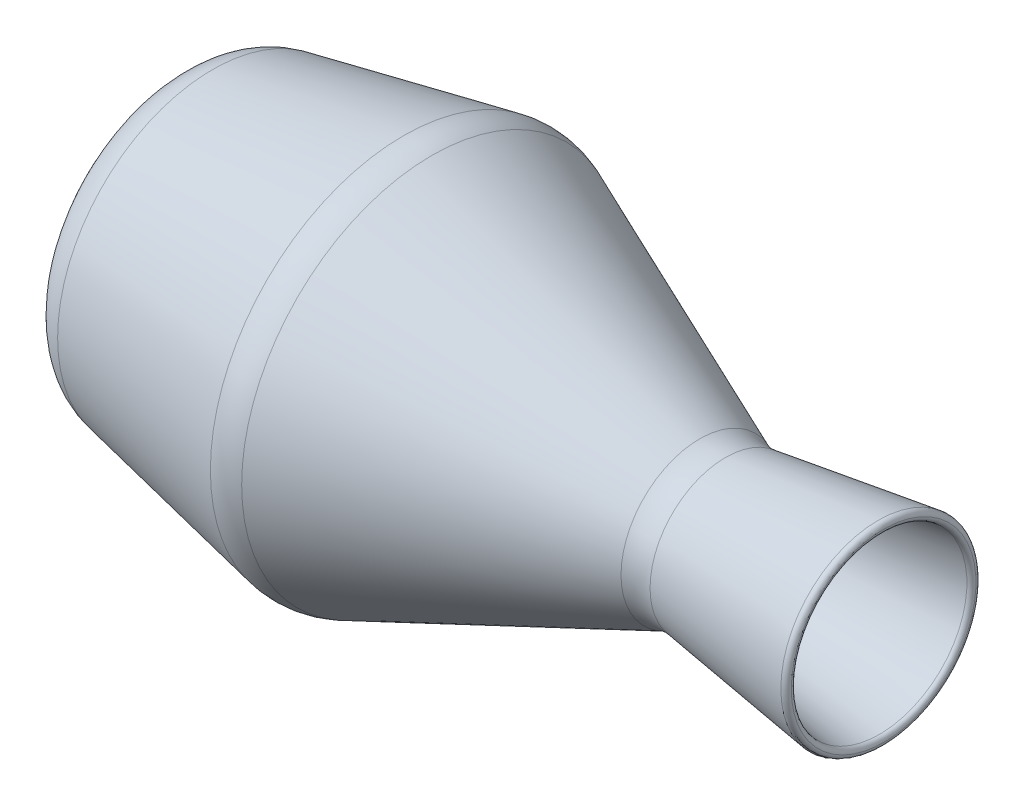
ISO-10303-21;
HEADER;
FILE_DESCRIPTION(('STEP AP214'),'2;1');
FILE_NAME('part.step','',(''),(''),'','','');
FILE_SCHEMA(('AUTOMOTIVE_DESIGN { 1 0 10303 214 1 1 1 1 }'));
ENDSEC;
DATA;
#1=APPLICATION_CONTEXT('core data for automotive mechanical design processes');
#2=APPLICATION_PROTOCOL_DEFINITION('international standard','automotive_design',2000,#1);
#3=PRODUCT_CONTEXT('',#1,'mechanical');
#4=PRODUCT('Part','Part','',(#3));
#5=PRODUCT_RELATED_PRODUCT_CATEGORY('part','',(#4));
#6=PRODUCT_DEFINITION_FORMATION('','',#4);
#7=PRODUCT_DEFINITION_CONTEXT('part definition',#1,'design');
#8=PRODUCT_DEFINITION('design','',#6,#7);
#9=PRODUCT_DEFINITION_SHAPE('','',#8);
#10=(LENGTH_UNIT() NAMED_UNIT(*) SI_UNIT(.MILLI.,.METRE.));
#11=(NAMED_UNIT(*) PLANE_ANGLE_UNIT() SI_UNIT($,.RADIAN.));
#12=(NAMED_UNIT(*) SI_UNIT($,.STERADIAN.) SOLID_ANGLE_UNIT());
#13=UNCERTAINTY_MEASURE_WITH_UNIT(LENGTH_MEASURE(1.E-05),#10,'distance_accuracy_value','');
#14=(GEOMETRIC_REPRESENTATION_CONTEXT(3) GLOBAL_UNCERTAINTY_ASSIGNED_CONTEXT((#13)) GLOBAL_UNIT_ASSIGNED_CONTEXT((#10,
#11,#12)) REPRESENTATION_CONTEXT('',''));
#15=CARTESIAN_POINT('',(0.,0.,0.));
#16=DIRECTION('',(0.,0.,1.));
#17=DIRECTION('',(1.,0.,0.));
#18=AXIS2_PLACEMENT_3D('',#15,#16,#17);
#19=CARTESIAN_POINT('',(30.9098844513369,0.,-4.58305425318152));
#20=DIRECTION('',(1.,0.,0.));
#21=DIRECTION('',(0.,0.,-1.));
#22=AXIS2_PLACEMENT_3D('',#19,#20,#21);
#23=CONICAL_SURFACE('',#22,12.9423259974754,0.141897054604164);
#24=CARTESIAN_POINT('',(33.6320099834152,0.,-4.58305425318152));
#25=DIRECTION('',(-1.,0.,0.));
#26=DIRECTION('',(0.,0.,1.));
#27=AXIS2_PLACEMENT_3D('',#24,#25,#26);
#28=CIRCLE('',#27,13.3312010734866);
#29=CARTESIAN_POINT('',(33.6320099834152,0.,8.7481468203051));
#30=VERTEX_POINT('',#29);
#31=EDGE_CURVE('E10',#30,#30,#28,.T.);
#32=ORIENTED_EDGE('',*,*,#31,.T.);
#33=EDGE_LOOP('',(#32));
#34=FACE_BOUND('',#33,.T.);
#35=CARTESIAN_POINT('',(65.3128882015152,0.,-4.58305425318152));
#36=DIRECTION('',(-1.,0.,0.));
#37=DIRECTION('',(0.,0.,1.));
#38=AXIS2_PLACEMENT_3D('',#35,#36,#37);
#39=CIRCLE('',#38,17.8570408189295);
#40=CARTESIAN_POINT('',(65.3128882015152,0.,13.273986565748));
#41=VERTEX_POINT('',#40);
#42=EDGE_CURVE('E79',#41,#41,#39,.F.);
#43=ORIENTED_EDGE('',*,*,#42,.T.);
#44=EDGE_LOOP('',(#43));
#45=FACE_BOUND('',#44,.T.);
#46=ADVANCED_FACE('F31',(#34,#45),#23,.F.);
#47=CARTESIAN_POINT('',(-29.0345745513105,0.,-4.58305425318152));
#48=DIRECTION('',(-1.,0.,0.));
#49=DIRECTION('',(0.,0.,1.));
#50=AXIS2_PLACEMENT_3D('',#47,#48,#49);
#51=CONICAL_SURFACE('',#50,37.9191839152452,0.394791119699762);
#52=CARTESIAN_POINT('',(-26.218627688099,0.,-4.58305425318152));
#53=DIRECTION('',(-1.,0.,0.));
#54=DIRECTION('',(0.,0.,1.));
#55=AXIS2_PLACEMENT_3D('',#52,#53,#54);
#56=CIRCLE('',#55,36.7458727222404);
#57=CARTESIAN_POINT('',(-26.218627688099,0.,32.1628184690589));
#58=VERTEX_POINT('',#57);
#59=EDGE_CURVE('E60',#58,#58,#56,.T.);
#60=ORIENTED_EDGE('',*,*,#59,.T.);
#61=EDGE_LOOP('',(#60));
#62=FACE_BOUND('',#61,.T.);
#63=CARTESIAN_POINT('',(28.3716425748883,0.,-4.58305425318152));
#64=DIRECTION('',(1.,0.,0.));
#65=DIRECTION('',(0.,0.,-1.));
#66=AXIS2_PLACEMENT_3D('',#63,#64,#65);
#67=CIRCLE('',#66,13.999926779329);
#68=CARTESIAN_POINT('',(28.3716425748883,0.,-18.5829810325106));
#69=VERTEX_POINT('',#68);
#70=EDGE_CURVE('E63',#69,#69,#67,.T.);
#71=ORIENTED_EDGE('',*,*,#70,.T.);
#72=EDGE_LOOP('',(#71));
#73=FACE_BOUND('',#72,.T.);
#74=ADVANCED_FACE('F106',(#62,#73),#51,.F.);
#75=CARTESIAN_POINT('',(-76.828533154722,0.,-4.58305425318152));
#76=DIRECTION('',(1.,0.,0.));
#77=DIRECTION('',(0.,0.,-1.));
#78=AXIS2_PLACEMENT_3D('',#75,#76,#77);
#79=CONICAL_SURFACE('',#78,28.3603921945629,0.197395559849881);
#80=CARTESIAN_POINT('',(-32.0259428856346,0.,-4.58305425318152));
#81=DIRECTION('',(1.,0.,0.));
#82=DIRECTION('',(0.,0.,-1.));
#83=AXIS2_PLACEMENT_3D('',#80,#81,#82);
#84=CIRCLE('',#83,37.3209102483804);
#85=CARTESIAN_POINT('',(-32.0259428856346,0.,-41.9039645015619));
#86=VERTEX_POINT('',#85);
#87=EDGE_CURVE('E54',#86,#86,#84,.T.);
#88=ORIENTED_EDGE('',*,*,#87,.T.);
#89=EDGE_LOOP('',(#88));
#90=FACE_BOUND('',#89,.T.);
#91=CARTESIAN_POINT('',(-68.7896945061039,0.,-4.58305425318152));
#92=DIRECTION('',(1.,0.,0.));
#93=DIRECTION('',(0.,0.,-1.));
#94=AXIS2_PLACEMENT_3D('',#91,#92,#93);
#95=CIRCLE('',#94,29.9681599242865);
#96=CARTESIAN_POINT('',(-68.7896945061039,0.,-34.551214177468));
#97=VERTEX_POINT('',#96);
#98=EDGE_CURVE('E57',#97,#97,#95,.F.);
#99=ORIENTED_EDGE('',*,*,#98,.T.);
#100=EDGE_LOOP('',(#99));
#101=FACE_BOUND('',#100,.T.);
#102=ADVANCED_FACE('F111',(#90,#101),#79,.F.);
#103=CARTESIAN_POINT('',(-76.828533154722,0.,-4.58305425318152));
#104=DIRECTION('',(-1.,0.,0.));
#105=DIRECTION('',(0.,0.,1.));
#106=AXIS2_PLACEMENT_3D('',#103,#104,#105);
#107=PLANE('',#106);
#108=CARTESIAN_POINT('',(-76.828533154722,0.,-4.58305425318152));
#109=DIRECTION('',(-1.,0.,0.));
#110=DIRECTION('',(0.,0.,1.));
#111=AXIS2_PLACEMENT_3D('',#108,#109,#110);
#112=CIRCLE('',#111,20.1623531673773);
#113=CARTESIAN_POINT('',(-76.828533154722,0.,15.5792989141958));
#114=VERTEX_POINT('',#113);
#115=EDGE_CURVE('E51',#114,#114,#112,.F.);
#116=ORIENTED_EDGE('',*,*,#115,.T.);
#117=EDGE_LOOP('',(#116));
#118=FACE_BOUND('',#117,.T.);
#119=ADVANCED_FACE('F117',(#118),#107,.F.);
#120=CARTESIAN_POINT('',(-78.8285331547221,0.,-4.58305425318152));
#121=DIRECTION('',(1.,0.,0.));
#122=DIRECTION('',(0.,0.,-1.));
#123=AXIS2_PLACEMENT_3D('',#120,#121,#122);
#124=PLANE('',#123);
#125=CARTESIAN_POINT('',(-78.8285331547221,0.,-4.58305425318152));
#126=DIRECTION('',(1.,0.,0.));
#127=DIRECTION('',(0.,0.,-1.));
#128=AXIS2_PLACEMENT_3D('',#125,#126,#127);
#129=CIRCLE('',#128,21.8019609728144);
#130=CARTESIAN_POINT('',(-78.8285331547221,0.,-26.3850152259959));
#131=VERTEX_POINT('',#130);
#132=EDGE_CURVE('E72',#131,#131,#129,.F.);
#133=ORIENTED_EDGE('',*,*,#132,.T.);
#134=EDGE_LOOP('',(#133));
#135=FACE_BOUND('',#134,.T.);
#136=ADVANCED_FACE('F121',(#135),#124,.F.);
#137=CARTESIAN_POINT('',(-28.828533154722,0.,-4.58305425318152));
#138=DIRECTION('',(1.,0.,0.));
#139=DIRECTION('',(0.,0.,-1.));
#140=AXIS2_PLACEMENT_3D('',#137,#138,#139);
#141=CONICAL_SURFACE('',#140,40.,0.197395559849881);
#142=CARTESIAN_POINT('',(-70.7896945061039,0.,-4.58305425318152));
#143=DIRECTION('',(-1.,0.,0.));
#144=DIRECTION('',(0.,0.,1.));
#145=AXIS2_PLACEMENT_3D('',#142,#143,#144);
#146=CIRCLE('',#145,31.6077677297236);
#147=CARTESIAN_POINT('',(-70.7896945061039,0.,27.0247134765421));
#148=VERTEX_POINT('',#147);
#149=EDGE_CURVE('E66',#148,#148,#146,.F.);
#150=ORIENTED_EDGE('',*,*,#149,.T.);
#151=EDGE_LOOP('',(#150));
#152=FACE_BOUND('',#151,.T.);
#153=CARTESIAN_POINT('',(-31.8199014890462,0.,-4.58305425318152));
#154=DIRECTION('',(-1.,0.,0.));
#155=DIRECTION('',(0.,0.,1.));
#156=AXIS2_PLACEMENT_3D('',#153,#154,#155);
#157=CIRCLE('',#156,39.4017263331352);
#158=CARTESIAN_POINT('',(-31.8199014890462,0.,34.8186720799537));
#159=VERTEX_POINT('',#158);
#160=EDGE_CURVE('E69',#159,#159,#157,.T.);
#161=ORIENTED_EDGE('',*,*,#160,.T.);
#162=EDGE_LOOP('',(#161));
#163=FACE_BOUND('',#162,.T.);
#164=ADVANCED_FACE('F125',(#152,#163),#141,.T.);
#165=CARTESIAN_POINT('',(31.171466845278,0.,-4.58305425318152));
#166=DIRECTION('',(-1.,0.,0.));
#167=DIRECTION('',(0.,0.,1.));
#168=AXIS2_PLACEMENT_3D('',#165,#166,#167);
#169=CONICAL_SURFACE('',#168,15.,0.394791119699762);
#170=CARTESIAN_POINT('',(28.6332249688293,0.,-4.58305425318152));
#171=DIRECTION('',(-1.,0.,0.));
#172=DIRECTION('',(0.,0.,1.));
#173=AXIS2_PLACEMENT_3D('',#170,#171,#172);
#174=CIRCLE('',#173,16.0576007818536);
#175=CARTESIAN_POINT('',(28.6332249688293,0.,11.4745465286721));
#176=VERTEX_POINT('',#175);
#177=EDGE_CURVE('E42',#176,#176,#174,.T.);
#178=ORIENTED_EDGE('',*,*,#177,.T.);
#179=EDGE_LOOP('',(#178));
#180=FACE_BOUND('',#179,.T.);
#181=CARTESIAN_POINT('',(-26.0125862915105,0.,-4.58305425318152));
#182=DIRECTION('',(1.,0.,0.));
#183=DIRECTION('',(0.,0.,-1.));
#184=AXIS2_PLACEMENT_3D('',#181,#182,#183);
#185=CIRCLE('',#184,38.8266888069952);
#186=CARTESIAN_POINT('',(-26.0125862915105,0.,-43.4097430601767));
#187=VERTEX_POINT('',#186);
#188=EDGE_CURVE('E46',#187,#187,#185,.T.);
#189=ORIENTED_EDGE('',*,*,#188,.T.);
#190=EDGE_LOOP('',(#189));
#191=FACE_BOUND('',#190,.T.);
#192=ADVANCED_FACE('F101',(#180,#191),#169,.T.);
#193=CARTESIAN_POINT('',(66.171466845278,0.,-4.58305425318152));
#194=DIRECTION('',(1.,0.,0.));
#195=DIRECTION('',(0.,0.,-1.));
#196=AXIS2_PLACEMENT_3D('',#193,#194,#195);
#197=CONICAL_SURFACE('',#196,20.,0.141897054604164);
#198=CARTESIAN_POINT('',(33.8935923773562,0.,-4.58305425318152));
#199=DIRECTION('',(1.,0.,0.));
#200=DIRECTION('',(0.,0.,-1.));
#201=AXIS2_PLACEMENT_3D('',#198,#199,#200);
#202=CIRCLE('',#201,15.3888750760112);
#203=CARTESIAN_POINT('',(33.8935923773562,0.,-19.9719293291927));
#204=VERTEX_POINT('',#203);
#205=EDGE_CURVE('E38',#204,#204,#202,.T.);
#206=ORIENTED_EDGE('',*,*,#205,.T.);
#207=EDGE_LOOP('',(#206));
#208=FACE_BOUND('',#207,.T.);
#209=CARTESIAN_POINT('',(65.0300454890406,0.,-4.58305425318152));
#210=DIRECTION('',(-1.,0.,0.));
#211=DIRECTION('',(0.,0.,1.));
#212=AXIS2_PLACEMENT_3D('',#209,#210,#211);
#213=CIRCLE('',#212,19.8369398062518);
#214=CARTESIAN_POINT('',(65.0300454890406,0.,15.2538855530703));
#215=VERTEX_POINT('',#214);
#216=EDGE_CURVE('E75',#215,#215,#213,.T.);
#217=ORIENTED_EDGE('',*,*,#216,.T.);
#218=EDGE_LOOP('',(#217));
#219=FACE_BOUND('',#218,.T.);
#220=ADVANCED_FACE('F95',(#208,#219),#197,.T.);
#221=CARTESIAN_POINT('',(65.171466845278,0.,-4.58305425318152));
#222=DIRECTION('',(-1.,0.,0.));
#223=DIRECTION('',(0.,0.,1.));
#224=AXIS2_PLACEMENT_3D('',#221,#222,#223);
#225=TOROIDAL_SURFACE('',#224,18.8469903125906,1.);
#226=ORIENTED_EDGE('',*,*,#216,.F.);
#227=EDGE_LOOP('',(#226));
#228=FACE_BOUND('',#227,.T.);
#229=CARTESIAN_POINT('',(66.171466845278,0.,-4.58305425318152));
#230=DIRECTION('',(-1.,0.,0.));
#231=DIRECTION('',(0.,0.,1.));
#232=AXIS2_PLACEMENT_3D('',#229,#230,#231);
#233=CIRCLE('',#232,18.8469903125906);
#234=CARTESIAN_POINT('',(66.171466845278,0.,14.2639360594091));
#235=VERTEX_POINT('',#234);
#236=EDGE_CURVE('E76',#235,#235,#233,.F.);
#237=ORIENTED_EDGE('',*,*,#236,.F.);
#238=EDGE_LOOP('',(#237));
#239=FACE_BOUND('',#238,.T.);
#240=ADVANCED_FACE('F90',(#228,#239),#225,.T.);
#241=CARTESIAN_POINT('',(65.171466845278,0.,-4.58305425318152));
#242=DIRECTION('',(-1.,0.,0.));
#243=DIRECTION('',(0.,0.,1.));
#244=AXIS2_PLACEMENT_3D('',#241,#242,#243);
#245=TOROIDAL_SURFACE('',#244,18.8469903125906,1.);
#246=ORIENTED_EDGE('',*,*,#42,.F.);
#247=EDGE_LOOP('',(#246));
#248=FACE_BOUND('',#247,.T.);
#249=ORIENTED_EDGE('',*,*,#236,.T.);
#250=EDGE_LOOP('',(#249));
#251=FACE_BOUND('',#250,.T.);
#252=ADVANCED_FACE('F86',(#248,#251),#245,.T.);
#253=CARTESIAN_POINT('',(-68.8285331547221,0.,-4.58305425318152));
#254=DIRECTION('',(1.,0.,0.));
#255=DIRECTION('',(0.,0.,-1.));
#256=AXIS2_PLACEMENT_3D('',#253,#254,#255);
#257=TOROIDAL_SURFACE('',#256,21.8019609728144,10.);
#258=ORIENTED_EDGE('',*,*,#149,.F.);
#259=EDGE_LOOP('',(#258));
#260=FACE_BOUND('',#259,.T.);
#261=ORIENTED_EDGE('',*,*,#132,.F.);
#262=EDGE_LOOP('',(#261));
#263=FACE_BOUND('',#262,.T.);
#264=ADVANCED_FACE('F89',(#260,#263),#257,.T.);
#265=CARTESIAN_POINT('',(-30.0647815342528,0.,-4.58305425318152));
#266=DIRECTION('',(-1.,0.,0.));
#267=DIRECTION('',(0.,0.,1.));
#268=AXIS2_PLACEMENT_3D('',#265,#266,#267);
#269=TOROIDAL_SURFACE('',#268,27.5151034914712,10.);
#270=ORIENTED_EDGE('',*,*,#87,.F.);
#271=EDGE_LOOP('',(#270));
#272=FACE_BOUND('',#271,.T.);
#273=ORIENTED_EDGE('',*,*,#59,.F.);
#274=EDGE_LOOP('',(#273));
#275=FACE_BOUND('',#274,.T.);
#276=ADVANCED_FACE('F159',(#272,#275),#269,.F.);
#277=CARTESIAN_POINT('',(-66.8285331547221,0.,-4.58305425318152));
#278=DIRECTION('',(-1.,0.,0.));
#279=DIRECTION('',(0.,0.,1.));
#280=AXIS2_PLACEMENT_3D('',#277,#278,#279);
#281=TOROIDAL_SURFACE('',#280,20.1623531673773,10.);
#282=ORIENTED_EDGE('',*,*,#115,.F.);
#283=EDGE_LOOP('',(#282));
#284=FACE_BOUND('',#283,.T.);
#285=ORIENTED_EDGE('',*,*,#98,.F.);
#286=EDGE_LOOP('',(#285));
#287=FACE_BOUND('',#286,.T.);
#288=ADVANCED_FACE('F151',(#284,#287),#281,.F.);
#289=CARTESIAN_POINT('',(32.4793788149831,0.,-4.58305425318152));
#290=DIRECTION('',(-1.,0.,0.));
#291=DIRECTION('',(0.,0.,1.));
#292=AXIS2_PLACEMENT_3D('',#289,#290,#291);
#293=TOROIDAL_SURFACE('',#292,25.2883700126228,10.);
#294=ORIENTED_EDGE('',*,*,#205,.F.);
#295=EDGE_LOOP('',(#294));
#296=FACE_BOUND('',#295,.T.);
#297=ORIENTED_EDGE('',*,*,#177,.F.);
#298=EDGE_LOOP('',(#297));
#299=FACE_BOUND('',#298,.T.);
#300=ADVANCED_FACE('F146',(#296,#299),#293,.F.);
#301=CARTESIAN_POINT('',(32.2177964210421,0.,-4.58305425318152));
#302=DIRECTION('',(1.,0.,0.));
#303=DIRECTION('',(0.,0.,-1.));
#304=AXIS2_PLACEMENT_3D('',#301,#302,#303);
#305=TOROIDAL_SURFACE('',#304,23.2306960100983,10.);
#306=ORIENTED_EDGE('',*,*,#70,.F.);
#307=EDGE_LOOP('',(#306));
#308=FACE_BOUND('',#307,.T.);
#309=ORIENTED_EDGE('',*,*,#31,.F.);
#310=EDGE_LOOP('',(#309));
#311=FACE_BOUND('',#310,.T.);
#312=ADVANCED_FACE('F140',(#308,#311),#305,.T.);
#313=CARTESIAN_POINT('',(-29.8587401376644,0.,-4.58305425318152));
#314=DIRECTION('',(1.,0.,0.));
#315=DIRECTION('',(0.,0.,-1.));
#316=AXIS2_PLACEMENT_3D('',#313,#314,#315);
#317=TOROIDAL_SURFACE('',#316,29.595919576226,10.);
#318=ORIENTED_EDGE('',*,*,#188,.F.);
#319=EDGE_LOOP('',(#318));
#320=FACE_BOUND('',#319,.T.);
#321=ORIENTED_EDGE('',*,*,#160,.F.);
#322=EDGE_LOOP('',(#321));
#323=FACE_BOUND('',#322,.T.);
#324=ADVANCED_FACE('F33',(#320,#323),#317,.T.);
#325=CLOSED_SHELL('',(#46,#74,#102,#119,#136,#164,#192,#220,#240,#252,#264,#276,#288,#300,#312,#324));
#326=MANIFOLD_SOLID_BREP('B2',#325);
#327=ADVANCED_BREP_SHAPE_REPRESENTATION('',(#18,#326),#14);
#328=SHAPE_DEFINITION_REPRESENTATION(#9,#327);
ENDSEC;
END-ISO-10303-21;
